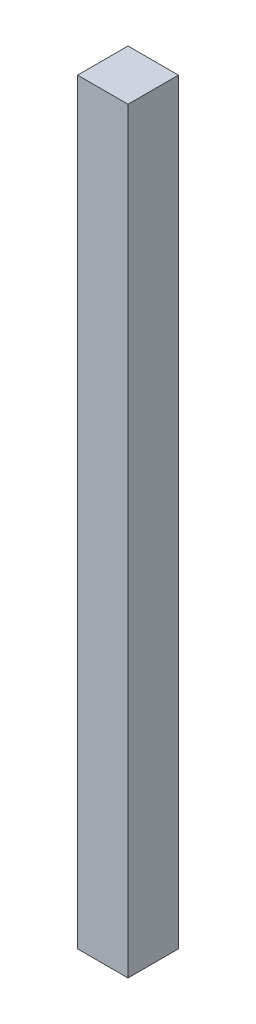
ISO-10303-21;
HEADER;
FILE_DESCRIPTION(('STEP AP214'),'2;1');
FILE_NAME('part.step','',(''),(''),'','','');
FILE_SCHEMA(('AUTOMOTIVE_DESIGN { 1 0 10303 214 1 1 1 1 }'));
ENDSEC;
DATA;
#1=APPLICATION_CONTEXT('core data for automotive mechanical design processes');
#2=APPLICATION_PROTOCOL_DEFINITION('international standard','automotive_design',2000,#1);
#3=PRODUCT_CONTEXT('',#1,'mechanical');
#4=PRODUCT('Part','Part','',(#3));
#5=PRODUCT_RELATED_PRODUCT_CATEGORY('part','',(#4));
#6=PRODUCT_DEFINITION_FORMATION('','',#4);
#7=PRODUCT_DEFINITION_CONTEXT('part definition',#1,'design');
#8=PRODUCT_DEFINITION('design','',#6,#7);
#9=PRODUCT_DEFINITION_SHAPE('','',#8);
#10=(LENGTH_UNIT() NAMED_UNIT(*) SI_UNIT(.MILLI.,.METRE.));
#11=(NAMED_UNIT(*) PLANE_ANGLE_UNIT() SI_UNIT($,.RADIAN.));
#12=(NAMED_UNIT(*) SI_UNIT($,.STERADIAN.) SOLID_ANGLE_UNIT());
#13=UNCERTAINTY_MEASURE_WITH_UNIT(LENGTH_MEASURE(1.E-05),#10,'distance_accuracy_value','');
#14=(GEOMETRIC_REPRESENTATION_CONTEXT(3) GLOBAL_UNCERTAINTY_ASSIGNED_CONTEXT((#13)) GLOBAL_UNIT_ASSIGNED_CONTEXT((#10,
#11,#12)) REPRESENTATION_CONTEXT('',''));
#15=CARTESIAN_POINT('',(0.,0.,0.));
#16=DIRECTION('',(0.,0.,1.));
#17=DIRECTION('',(1.,0.,0.));
#18=AXIS2_PLACEMENT_3D('',#15,#16,#17);
#19=CARTESIAN_POINT('',(10.,300.,10.));
#20=DIRECTION('',(-1.,0.,0.));
#21=DIRECTION('',(0.,0.,1.));
#22=AXIS2_PLACEMENT_3D('',#19,#20,#21);
#23=PLANE('',#22);
#24=DIRECTION('',(0.,0.,-1.));
#25=VECTOR('',#24,1.);
#26=CARTESIAN_POINT('',(10.,0.,10.));
#27=LINE('',#26,#25);
#28=CARTESIAN_POINT('',(10.,0.,10.));
#29=VERTEX_POINT('',#28);
#30=CARTESIAN_POINT('',(10.,0.,-10.));
#31=VERTEX_POINT('',#30);
#32=EDGE_CURVE('E96',#29,#31,#27,.T.);
#33=ORIENTED_EDGE('',*,*,#32,.T.);
#34=DIRECTION('',(0.,-1.,0.));
#35=VECTOR('',#34,1.);
#36=CARTESIAN_POINT('',(10.,300.,-10.));
#37=LINE('',#36,#35);
#38=CARTESIAN_POINT('',(10.,300.,-10.));
#39=VERTEX_POINT('',#38);
#40=EDGE_CURVE('E11',#39,#31,#37,.T.);
#41=ORIENTED_EDGE('',*,*,#40,.F.);
#42=DIRECTION('',(0.,0.,-1.));
#43=VECTOR('',#42,1.);
#44=CARTESIAN_POINT('',(10.,300.,10.));
#45=LINE('',#44,#43);
#46=CARTESIAN_POINT('',(10.,300.,10.));
#47=VERTEX_POINT('',#46);
#48=EDGE_CURVE('E84',#47,#39,#45,.T.);
#49=ORIENTED_EDGE('',*,*,#48,.F.);
#50=DIRECTION('',(0.,-1.,0.));
#51=VECTOR('',#50,1.);
#52=CARTESIAN_POINT('',(10.,300.,10.));
#53=LINE('',#52,#51);
#54=EDGE_CURVE('E92',#47,#29,#53,.T.);
#55=ORIENTED_EDGE('',*,*,#54,.T.);
#56=EDGE_LOOP('',(#33,#41,#49,#55));
#57=FACE_BOUND('',#56,.T.);
#58=ADVANCED_FACE('F33',(#57),#23,.F.);
#59=CARTESIAN_POINT('',(-10.,300.,-10.));
#60=DIRECTION('',(0.,0.,1.));
#61=DIRECTION('',(1.,0.,0.));
#62=AXIS2_PLACEMENT_3D('',#59,#60,#61);
#63=PLANE('',#62);
#64=DIRECTION('',(-1.,0.,0.));
#65=VECTOR('',#64,1.);
#66=CARTESIAN_POINT('',(-10.,0.,-10.));
#67=LINE('',#66,#65);
#68=CARTESIAN_POINT('',(-10.,0.,-10.));
#69=VERTEX_POINT('',#68);
#70=EDGE_CURVE('E88',#31,#69,#67,.T.);
#71=ORIENTED_EDGE('',*,*,#70,.T.);
#72=DIRECTION('',(0.,-1.,0.));
#73=VECTOR('',#72,1.);
#74=CARTESIAN_POINT('',(-10.,300.,-10.));
#75=LINE('',#74,#73);
#76=CARTESIAN_POINT('',(-10.,300.,-10.));
#77=VERTEX_POINT('',#76);
#78=EDGE_CURVE('E41',#77,#69,#75,.T.);
#79=ORIENTED_EDGE('',*,*,#78,.F.);
#80=DIRECTION('',(-1.,0.,0.));
#81=VECTOR('',#80,1.);
#82=CARTESIAN_POINT('',(-10.,300.,-10.));
#83=LINE('',#82,#81);
#84=EDGE_CURVE('E79',#39,#77,#83,.T.);
#85=ORIENTED_EDGE('',*,*,#84,.F.);
#86=ORIENTED_EDGE('',*,*,#40,.T.);
#87=EDGE_LOOP('',(#71,#79,#85,#86));
#88=FACE_BOUND('',#87,.T.);
#89=ADVANCED_FACE('F87',(#88),#63,.F.);
#90=CARTESIAN_POINT('',(-10.,300.,10.));
#91=DIRECTION('',(1.,0.,0.));
#92=DIRECTION('',(0.,0.,-1.));
#93=AXIS2_PLACEMENT_3D('',#90,#91,#92);
#94=PLANE('',#93);
#95=DIRECTION('',(0.,0.,1.));
#96=VECTOR('',#95,1.);
#97=CARTESIAN_POINT('',(-10.,0.,10.));
#98=LINE('',#97,#96);
#99=CARTESIAN_POINT('',(-10.,0.,10.));
#100=VERTEX_POINT('',#99);
#101=EDGE_CURVE('E66',#69,#100,#98,.T.);
#102=ORIENTED_EDGE('',*,*,#101,.T.);
#103=DIRECTION('',(0.,-1.,0.));
#104=VECTOR('',#103,1.);
#105=CARTESIAN_POINT('',(-10.,300.,10.));
#106=LINE('',#105,#104);
#107=CARTESIAN_POINT('',(-10.,300.,10.));
#108=VERTEX_POINT('',#107);
#109=EDGE_CURVE('E89',#108,#100,#106,.T.);
#110=ORIENTED_EDGE('',*,*,#109,.F.);
#111=DIRECTION('',(0.,0.,1.));
#112=VECTOR('',#111,1.);
#113=CARTESIAN_POINT('',(-10.,300.,10.));
#114=LINE('',#113,#112);
#115=EDGE_CURVE('E82',#77,#108,#114,.T.);
#116=ORIENTED_EDGE('',*,*,#115,.F.);
#117=ORIENTED_EDGE('',*,*,#78,.T.);
#118=EDGE_LOOP('',(#102,#110,#116,#117));
#119=FACE_BOUND('',#118,.T.);
#120=ADVANCED_FACE('F90',(#119),#94,.F.);
#121=CARTESIAN_POINT('',(-10.,300.,10.));
#122=DIRECTION('',(0.,0.,-1.));
#123=DIRECTION('',(-1.,0.,0.));
#124=AXIS2_PLACEMENT_3D('',#121,#122,#123);
#125=PLANE('',#124);
#126=DIRECTION('',(1.,0.,0.));
#127=VECTOR('',#126,1.);
#128=CARTESIAN_POINT('',(-10.,0.,10.));
#129=LINE('',#128,#127);
#130=EDGE_CURVE('E72',#100,#29,#129,.T.);
#131=ORIENTED_EDGE('',*,*,#130,.T.);
#132=ORIENTED_EDGE('',*,*,#54,.F.);
#133=DIRECTION('',(1.,0.,0.));
#134=VECTOR('',#133,1.);
#135=CARTESIAN_POINT('',(-10.,300.,10.));
#136=LINE('',#135,#134);
#137=EDGE_CURVE('E49',#108,#47,#136,.T.);
#138=ORIENTED_EDGE('',*,*,#137,.F.);
#139=ORIENTED_EDGE('',*,*,#109,.T.);
#140=EDGE_LOOP('',(#131,#132,#138,#139));
#141=FACE_BOUND('',#140,.T.);
#142=ADVANCED_FACE('F103',(#141),#125,.F.);
#143=CARTESIAN_POINT('',(0.,300.,0.));
#144=DIRECTION('',(0.,-1.,0.));
#145=DIRECTION('',(0.,0.,-1.));
#146=AXIS2_PLACEMENT_3D('',#143,#144,#145);
#147=PLANE('',#146);
#148=ORIENTED_EDGE('',*,*,#48,.T.);
#149=ORIENTED_EDGE('',*,*,#84,.T.);
#150=ORIENTED_EDGE('',*,*,#115,.T.);
#151=ORIENTED_EDGE('',*,*,#137,.T.);
#152=EDGE_LOOP('',(#148,#149,#150,#151));
#153=FACE_BOUND('',#152,.T.);
#154=ADVANCED_FACE('F80',(#153),#147,.F.);
#155=CARTESIAN_POINT('',(0.,0.,0.));
#156=DIRECTION('',(0.,-1.,0.));
#157=DIRECTION('',(0.,0.,-1.));
#158=AXIS2_PLACEMENT_3D('',#155,#156,#157);
#159=PLANE('',#158);
#160=ORIENTED_EDGE('',*,*,#32,.F.);
#161=ORIENTED_EDGE('',*,*,#130,.F.);
#162=ORIENTED_EDGE('',*,*,#101,.F.);
#163=ORIENTED_EDGE('',*,*,#70,.F.);
#164=EDGE_LOOP('',(#160,#161,#162,#163));
#165=FACE_BOUND('',#164,.T.);
#166=ADVANCED_FACE('F106',(#165),#159,.T.);
#167=CLOSED_SHELL('',(#58,#89,#120,#142,#154,#166));
#168=MANIFOLD_SOLID_BREP('B2',#167);
#169=ADVANCED_BREP_SHAPE_REPRESENTATION('',(#18,#168),#14);
#170=SHAPE_DEFINITION_REPRESENTATION(#9,#169);
ENDSEC;
END-ISO-10303-21;
